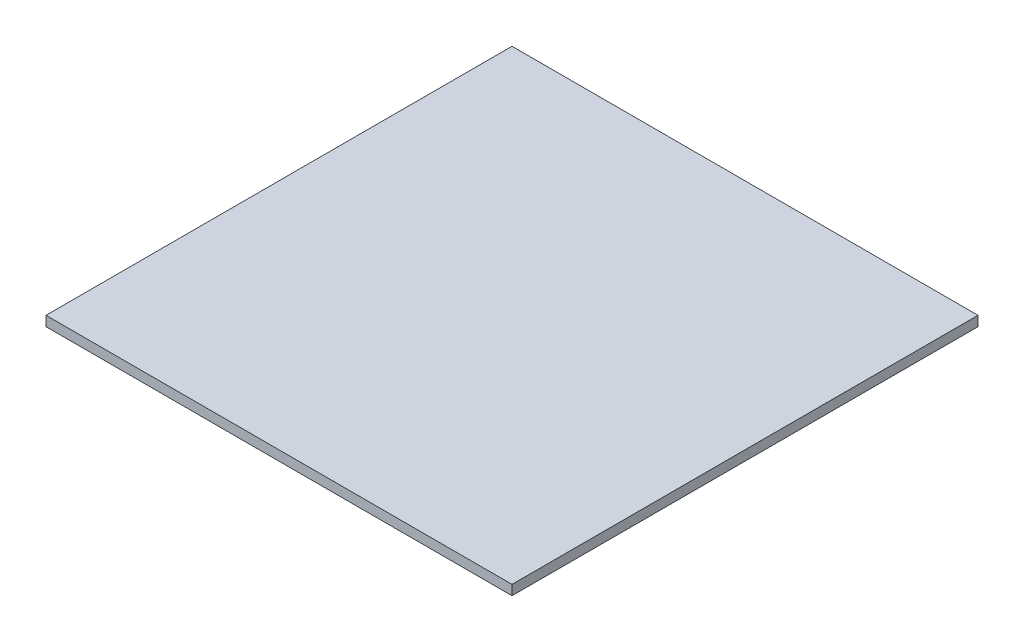
ISO-10303-21;
HEADER;
FILE_DESCRIPTION(('STEP AP214'),'2;1');
FILE_NAME('part.step','',(''),(''),'','','');
FILE_SCHEMA(('AUTOMOTIVE_DESIGN { 1 0 10303 214 1 1 1 1 }'));
ENDSEC;
DATA;
#1=APPLICATION_CONTEXT('core data for automotive mechanical design processes');
#2=APPLICATION_PROTOCOL_DEFINITION('international standard','automotive_design',2000,#1);
#3=PRODUCT_CONTEXT('',#1,'mechanical');
#4=PRODUCT('Part','Part','',(#3));
#5=PRODUCT_RELATED_PRODUCT_CATEGORY('part','',(#4));
#6=PRODUCT_DEFINITION_FORMATION('','',#4);
#7=PRODUCT_DEFINITION_CONTEXT('part definition',#1,'design');
#8=PRODUCT_DEFINITION('design','',#6,#7);
#9=PRODUCT_DEFINITION_SHAPE('','',#8);
#10=(LENGTH_UNIT() NAMED_UNIT(*) SI_UNIT(.MILLI.,.METRE.));
#11=(NAMED_UNIT(*) PLANE_ANGLE_UNIT() SI_UNIT($,.RADIAN.));
#12=(NAMED_UNIT(*) SI_UNIT($,.STERADIAN.) SOLID_ANGLE_UNIT());
#13=UNCERTAINTY_MEASURE_WITH_UNIT(LENGTH_MEASURE(1.E-05),#10,'distance_accuracy_value','');
#14=(GEOMETRIC_REPRESENTATION_CONTEXT(3) GLOBAL_UNCERTAINTY_ASSIGNED_CONTEXT((#13)) GLOBAL_UNIT_ASSIGNED_CONTEXT((#10,
#11,#12)) REPRESENTATION_CONTEXT('',''));
#15=CARTESIAN_POINT('',(0.,0.,0.));
#16=DIRECTION('',(0.,0.,1.));
#17=DIRECTION('',(1.,0.,0.));
#18=AXIS2_PLACEMENT_3D('',#15,#16,#17);
#19=CARTESIAN_POINT('',(150.,6.35,150.));
#20=DIRECTION('',(-1.,0.,0.));
#21=DIRECTION('',(0.,0.,1.));
#22=AXIS2_PLACEMENT_3D('',#19,#20,#21);
#23=PLANE('',#22);
#24=DIRECTION('',(0.,0.,-1.));
#25=VECTOR('',#24,1.);
#26=CARTESIAN_POINT('',(150.,0.,150.));
#27=LINE('',#26,#25);
#28=CARTESIAN_POINT('',(150.,0.,150.));
#29=VERTEX_POINT('',#28);
#30=CARTESIAN_POINT('',(150.,0.,-150.));
#31=VERTEX_POINT('',#30);
#32=EDGE_CURVE('E102',#29,#31,#27,.T.);
#33=ORIENTED_EDGE('',*,*,#32,.T.);
#34=DIRECTION('',(0.,-1.,0.));
#35=VECTOR('',#34,1.);
#36=CARTESIAN_POINT('',(150.,6.35,-150.));
#37=LINE('',#36,#35);
#38=CARTESIAN_POINT('',(150.,6.35,-150.));
#39=VERTEX_POINT('',#38);
#40=EDGE_CURVE('E11',#39,#31,#37,.T.);
#41=ORIENTED_EDGE('',*,*,#40,.F.);
#42=DIRECTION('',(0.,0.,-1.));
#43=VECTOR('',#42,1.);
#44=CARTESIAN_POINT('',(150.,6.35,150.));
#45=LINE('',#44,#43);
#46=CARTESIAN_POINT('',(150.,6.35,150.));
#47=VERTEX_POINT('',#46);
#48=EDGE_CURVE('E87',#47,#39,#45,.T.);
#49=ORIENTED_EDGE('',*,*,#48,.F.);
#50=DIRECTION('',(0.,-1.,0.));
#51=VECTOR('',#50,1.);
#52=CARTESIAN_POINT('',(150.,6.35,150.));
#53=LINE('',#52,#51);
#54=EDGE_CURVE('E98',#47,#29,#53,.T.);
#55=ORIENTED_EDGE('',*,*,#54,.T.);
#56=EDGE_LOOP('',(#33,#41,#49,#55));
#57=FACE_BOUND('',#56,.T.);
#58=ADVANCED_FACE('F36',(#57),#23,.F.);
#59=CARTESIAN_POINT('',(-150.,6.35,-150.));
#60=DIRECTION('',(0.,0.,1.));
#61=DIRECTION('',(1.,0.,0.));
#62=AXIS2_PLACEMENT_3D('',#59,#60,#61);
#63=PLANE('',#62);
#64=DIRECTION('',(-1.,0.,0.));
#65=VECTOR('',#64,1.);
#66=CARTESIAN_POINT('',(-150.,0.,-150.));
#67=LINE('',#66,#65);
#68=CARTESIAN_POINT('',(-150.,0.,-150.));
#69=VERTEX_POINT('',#68);
#70=EDGE_CURVE('E91',#31,#69,#67,.T.);
#71=ORIENTED_EDGE('',*,*,#70,.T.);
#72=DIRECTION('',(0.,-1.,0.));
#73=VECTOR('',#72,1.);
#74=CARTESIAN_POINT('',(-150.,6.35,-150.));
#75=LINE('',#74,#73);
#76=CARTESIAN_POINT('',(-150.,6.35,-150.));
#77=VERTEX_POINT('',#76);
#78=EDGE_CURVE('E44',#77,#69,#75,.T.);
#79=ORIENTED_EDGE('',*,*,#78,.F.);
#80=DIRECTION('',(-1.,0.,0.));
#81=VECTOR('',#80,1.);
#82=CARTESIAN_POINT('',(-150.,6.35,-150.));
#83=LINE('',#82,#81);
#84=EDGE_CURVE('E82',#39,#77,#83,.T.);
#85=ORIENTED_EDGE('',*,*,#84,.F.);
#86=ORIENTED_EDGE('',*,*,#40,.T.);
#87=EDGE_LOOP('',(#71,#79,#85,#86));
#88=FACE_BOUND('',#87,.T.);
#89=ADVANCED_FACE('F90',(#88),#63,.F.);
#90=CARTESIAN_POINT('',(-150.,6.35,150.));
#91=DIRECTION('',(1.,0.,0.));
#92=DIRECTION('',(0.,0.,-1.));
#93=AXIS2_PLACEMENT_3D('',#90,#91,#92);
#94=PLANE('',#93);
#95=DIRECTION('',(0.,0.,1.));
#96=VECTOR('',#95,1.);
#97=CARTESIAN_POINT('',(-150.,0.,150.));
#98=LINE('',#97,#96);
#99=CARTESIAN_POINT('',(-150.,0.,150.));
#100=VERTEX_POINT('',#99);
#101=EDGE_CURVE('E69',#69,#100,#98,.T.);
#102=ORIENTED_EDGE('',*,*,#101,.T.);
#103=DIRECTION('',(0.,-1.,0.));
#104=VECTOR('',#103,1.);
#105=CARTESIAN_POINT('',(-150.,6.35,150.));
#106=LINE('',#105,#104);
#107=CARTESIAN_POINT('',(-150.,6.35,150.));
#108=VERTEX_POINT('',#107);
#109=EDGE_CURVE('E92',#108,#100,#106,.T.);
#110=ORIENTED_EDGE('',*,*,#109,.F.);
#111=DIRECTION('',(0.,0.,1.));
#112=VECTOR('',#111,1.);
#113=CARTESIAN_POINT('',(-150.,6.35,150.));
#114=LINE('',#113,#112);
#115=EDGE_CURVE('E85',#77,#108,#114,.T.);
#116=ORIENTED_EDGE('',*,*,#115,.F.);
#117=ORIENTED_EDGE('',*,*,#78,.T.);
#118=EDGE_LOOP('',(#102,#110,#116,#117));
#119=FACE_BOUND('',#118,.T.);
#120=ADVANCED_FACE('F93',(#119),#94,.F.);
#121=CARTESIAN_POINT('',(-150.,6.35,150.));
#122=DIRECTION('',(0.,0.,-1.));
#123=DIRECTION('',(-1.,0.,0.));
#124=AXIS2_PLACEMENT_3D('',#121,#122,#123);
#125=PLANE('',#124);
#126=DIRECTION('',(1.,0.,0.));
#127=VECTOR('',#126,1.);
#128=CARTESIAN_POINT('',(-150.,0.,150.));
#129=LINE('',#128,#127);
#130=EDGE_CURVE('E75',#100,#29,#129,.T.);
#131=ORIENTED_EDGE('',*,*,#130,.T.);
#132=ORIENTED_EDGE('',*,*,#54,.F.);
#133=DIRECTION('',(1.,0.,0.));
#134=VECTOR('',#133,1.);
#135=CARTESIAN_POINT('',(-150.,6.35,150.));
#136=LINE('',#135,#134);
#137=EDGE_CURVE('E52',#108,#47,#136,.T.);
#138=ORIENTED_EDGE('',*,*,#137,.F.);
#139=ORIENTED_EDGE('',*,*,#109,.T.);
#140=EDGE_LOOP('',(#131,#132,#138,#139));
#141=FACE_BOUND('',#140,.T.);
#142=ADVANCED_FACE('F110',(#141),#125,.F.);
#143=CARTESIAN_POINT('',(0.,6.35,0.));
#144=DIRECTION('',(0.,-1.,0.));
#145=DIRECTION('',(0.,0.,-1.));
#146=AXIS2_PLACEMENT_3D('',#143,#144,#145);
#147=PLANE('',#146);
#148=ORIENTED_EDGE('',*,*,#48,.T.);
#149=ORIENTED_EDGE('',*,*,#84,.T.);
#150=ORIENTED_EDGE('',*,*,#115,.T.);
#151=ORIENTED_EDGE('',*,*,#137,.T.);
#152=EDGE_LOOP('',(#148,#149,#150,#151));
#153=FACE_BOUND('',#152,.T.);
#154=ADVANCED_FACE('F83',(#153),#147,.F.);
#155=CARTESIAN_POINT('',(0.,0.,0.));
#156=DIRECTION('',(0.,-1.,0.));
#157=DIRECTION('',(0.,0.,-1.));
#158=AXIS2_PLACEMENT_3D('',#155,#156,#157);
#159=PLANE('',#158);
#160=ORIENTED_EDGE('',*,*,#32,.F.);
#161=ORIENTED_EDGE('',*,*,#130,.F.);
#162=ORIENTED_EDGE('',*,*,#101,.F.);
#163=ORIENTED_EDGE('',*,*,#70,.F.);
#164=EDGE_LOOP('',(#160,#161,#162,#163));
#165=FACE_BOUND('',#164,.T.);
#166=ADVANCED_FACE('F113',(#165),#159,.T.);
#167=CLOSED_SHELL('',(#58,#89,#120,#142,#154,#166));
#168=MANIFOLD_SOLID_BREP('B2',#167);
#169=ADVANCED_BREP_SHAPE_REPRESENTATION('',(#18,#168),#14);
#170=SHAPE_DEFINITION_REPRESENTATION(#9,#169);
ENDSEC;
END-ISO-10303-21;
